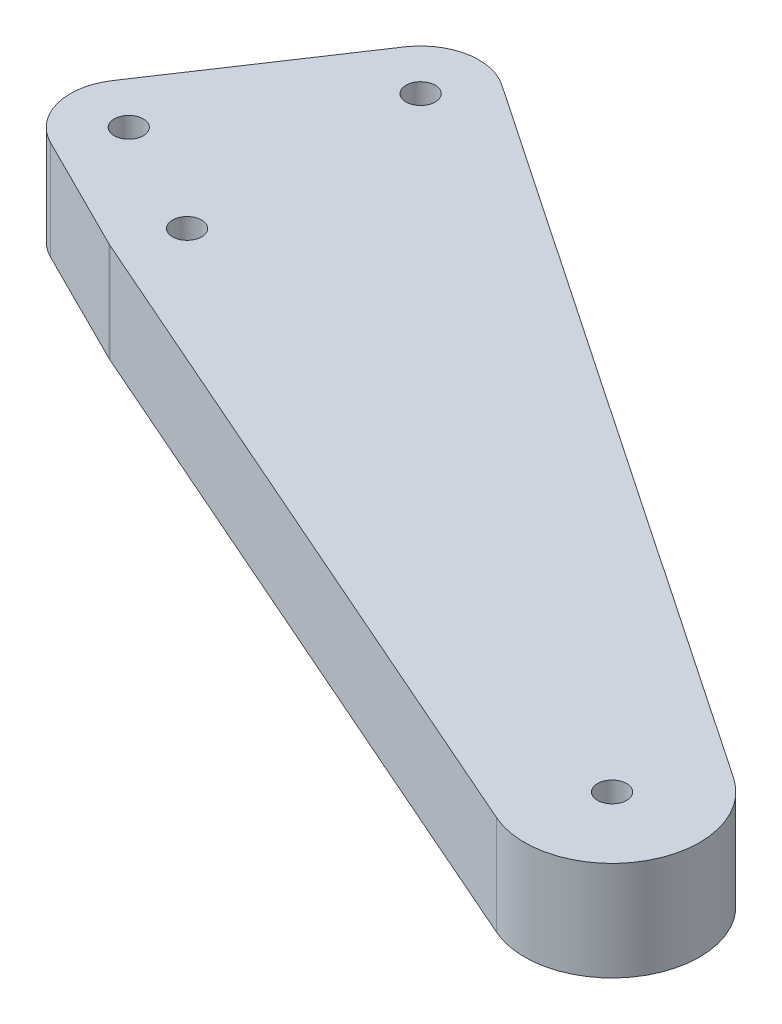
ISO-10303-21;
HEADER;
FILE_DESCRIPTION(('STEP AP214'),'2;1');
FILE_NAME('part.step','',(''),(''),'','','');
FILE_SCHEMA(('AUTOMOTIVE_DESIGN { 1 0 10303 214 1 1 1 1 }'));
ENDSEC;
DATA;
#1=APPLICATION_CONTEXT('core data for automotive mechanical design processes');
#2=APPLICATION_PROTOCOL_DEFINITION('international standard','automotive_design',2000,#1);
#3=PRODUCT_CONTEXT('',#1,'mechanical');
#4=PRODUCT('Part','Part','',(#3));
#5=PRODUCT_RELATED_PRODUCT_CATEGORY('part','',(#4));
#6=PRODUCT_DEFINITION_FORMATION('','',#4);
#7=PRODUCT_DEFINITION_CONTEXT('part definition',#1,'design');
#8=PRODUCT_DEFINITION('design','',#6,#7);
#9=PRODUCT_DEFINITION_SHAPE('','',#8);
#10=(LENGTH_UNIT() NAMED_UNIT(*) SI_UNIT(.MILLI.,.METRE.));
#11=(NAMED_UNIT(*) PLANE_ANGLE_UNIT() SI_UNIT($,.RADIAN.));
#12=(NAMED_UNIT(*) SI_UNIT($,.STERADIAN.) SOLID_ANGLE_UNIT());
#13=UNCERTAINTY_MEASURE_WITH_UNIT(LENGTH_MEASURE(1.E-05),#10,'distance_accuracy_value','');
#14=(GEOMETRIC_REPRESENTATION_CONTEXT(3) GLOBAL_UNCERTAINTY_ASSIGNED_CONTEXT((#13)) GLOBAL_UNIT_ASSIGNED_CONTEXT((#10,
#11,#12)) REPRESENTATION_CONTEXT('',''));
#15=CARTESIAN_POINT('',(0.,0.,0.));
#16=DIRECTION('',(0.,0.,1.));
#17=DIRECTION('',(1.,0.,0.));
#18=AXIS2_PLACEMENT_3D('',#15,#16,#17);
#19=CARTESIAN_POINT('',(0.,17.,0.));
#20=DIRECTION('',(0.,-1.,0.));
#21=DIRECTION('',(0.,0.,-1.));
#22=AXIS2_PLACEMENT_3D('',#19,#20,#21);
#23=CYLINDRICAL_SURFACE('',#22,9.99999999999999);
#24=CARTESIAN_POINT('',(0.,0.,0.));
#25=DIRECTION('',(0.,1.,0.));
#26=DIRECTION('',(0.,0.,-1.));
#27=AXIS2_PLACEMENT_3D('',#24,#25,#26);
#28=CIRCLE('',#27,9.99999999999999);
#29=CARTESIAN_POINT('',(-4.47213595499958,0.,8.94427190999916));
#30=VERTEX_POINT('',#29);
#31=CARTESIAN_POINT('',(-4.01845025204397,0.,9.15707691197621));
#32=VERTEX_POINT('',#31);
#33=EDGE_CURVE('E144',#30,#32,#28,.T.);
#34=ORIENTED_EDGE('',*,*,#33,.T.);
#35=DIRECTION('',(0.,-1.,0.));
#36=VECTOR('',#35,1.);
#37=CARTESIAN_POINT('',(-4.01845025204397,17.,9.15707691197621));
#38=LINE('',#37,#36);
#39=CARTESIAN_POINT('',(-4.01845025204397,17.,9.15707691197621));
#40=VERTEX_POINT('',#39);
#41=EDGE_CURVE('E11',#40,#32,#38,.T.);
#42=ORIENTED_EDGE('',*,*,#41,.F.);
#43=CARTESIAN_POINT('',(0.,17.,0.));
#44=DIRECTION('',(0.,1.,0.));
#45=DIRECTION('',(0.,0.,-1.));
#46=AXIS2_PLACEMENT_3D('',#43,#44,#45);
#47=CIRCLE('',#46,9.99999999999999);
#48=CARTESIAN_POINT('',(-4.47213595499958,17.,8.94427190999916));
#49=VERTEX_POINT('',#48);
#50=EDGE_CURVE('E167',#49,#40,#47,.T.);
#51=ORIENTED_EDGE('',*,*,#50,.F.);
#52=DIRECTION('',(0.,-1.,0.));
#53=VECTOR('',#52,1.);
#54=CARTESIAN_POINT('',(-4.47213595499958,17.,8.94427190999916));
#55=LINE('',#54,#53);
#56=EDGE_CURVE('E140',#49,#30,#55,.T.);
#57=ORIENTED_EDGE('',*,*,#56,.T.);
#58=EDGE_LOOP('',(#34,#42,#51,#57));
#59=FACE_BOUND('',#58,.T.);
#60=ADVANCED_FACE('F43',(#59),#23,.T.);
#61=CARTESIAN_POINT('',(113.972324621934,17.,60.9356153679643));
#62=DIRECTION('',(0.401845025204397,0.,-0.915707691197621));
#63=DIRECTION('',(-0.915707691197621,0.,-0.401845025204397));
#64=AXIS2_PLACEMENT_3D('',#61,#62,#63);
#65=PLANE('',#64);
#66=DIRECTION('',(0.915707691197621,0.,0.401845025204397));
#67=VECTOR('',#66,1.);
#68=CARTESIAN_POINT('',(113.972324621934,0.,60.9356153679643));
#69=LINE('',#68,#67);
#70=CARTESIAN_POINT('',(113.972324621934,0.,60.9356153679643));
#71=VERTEX_POINT('',#70);
#72=EDGE_CURVE('E148',#32,#71,#69,.T.);
#73=ORIENTED_EDGE('',*,*,#72,.T.);
#74=DIRECTION('',(0.,-1.,0.));
#75=VECTOR('',#74,1.);
#76=CARTESIAN_POINT('',(113.972324621934,17.,60.9356153679643));
#77=LINE('',#76,#75);
#78=CARTESIAN_POINT('',(113.972324621934,17.,60.9356153679643));
#79=VERTEX_POINT('',#78);
#80=EDGE_CURVE('E52',#79,#71,#77,.T.);
#81=ORIENTED_EDGE('',*,*,#80,.F.);
#82=DIRECTION('',(0.915707691197621,0.,0.401845025204397));
#83=VECTOR('',#82,1.);
#84=CARTESIAN_POINT('',(113.972324621934,17.,60.9356153679643));
#85=LINE('',#84,#83);
#86=EDGE_CURVE('E103',#40,#79,#85,.T.);
#87=ORIENTED_EDGE('',*,*,#86,.F.);
#88=ORIENTED_EDGE('',*,*,#41,.T.);
#89=EDGE_LOOP('',(#73,#81,#87,#88));
#90=FACE_BOUND('',#89,.T.);
#91=ADVANCED_FACE('F276',(#90),#65,.F.);
#92=CARTESIAN_POINT('',(120.,17.,47.2));
#93=DIRECTION('',(0.,-1.,0.));
#94=DIRECTION('',(0.,0.,-1.));
#95=AXIS2_PLACEMENT_3D('',#92,#93,#94);
#96=CYLINDRICAL_SURFACE('',#95,15.);
#97=CARTESIAN_POINT('',(120.,0.,47.2));
#98=DIRECTION('',(0.,1.,0.));
#99=DIRECTION('',(0.,0.,-1.));
#100=AXIS2_PLACEMENT_3D('',#97,#98,#99);
#101=CIRCLE('',#100,15.);
#102=CARTESIAN_POINT('',(128.403734524762,0.,34.7751359750975));
#103=VERTEX_POINT('',#102);
#104=EDGE_CURVE('E152',#71,#103,#101,.T.);
#105=ORIENTED_EDGE('',*,*,#104,.T.);
#106=DIRECTION('',(0.,-1.,0.));
#107=VECTOR('',#106,1.);
#108=CARTESIAN_POINT('',(128.403734524762,17.,34.7751359750975));
#109=LINE('',#108,#107);
#110=CARTESIAN_POINT('',(128.403734524762,17.,34.7751359750975));
#111=VERTEX_POINT('',#110);
#112=EDGE_CURVE('E178',#111,#103,#109,.T.);
#113=ORIENTED_EDGE('',*,*,#112,.F.);
#114=CARTESIAN_POINT('',(120.,17.,47.2));
#115=DIRECTION('',(0.,1.,0.));
#116=DIRECTION('',(0.,0.,-1.));
#117=AXIS2_PLACEMENT_3D('',#114,#115,#116);
#118=CIRCLE('',#117,15.);
#119=EDGE_CURVE('E188',#79,#111,#118,.T.);
#120=ORIENTED_EDGE('',*,*,#119,.F.);
#121=ORIENTED_EDGE('',*,*,#80,.T.);
#122=EDGE_LOOP('',(#105,#113,#120,#121));
#123=FACE_BOUND('',#122,.T.);
#124=ADVANCED_FACE('F186',(#123),#96,.T.);
#125=CARTESIAN_POINT('',(5.60248968317497,17.,-48.2832426832683));
#126=DIRECTION('',(-0.560248968317497,0.,0.828324268326831));
#127=DIRECTION('',(0.828324268326831,0.,0.560248968317497));
#128=AXIS2_PLACEMENT_3D('',#125,#126,#127);
#129=PLANE('',#128);
#130=DIRECTION('',(-0.828324268326831,0.,-0.560248968317497));
#131=VECTOR('',#130,1.);
#132=CARTESIAN_POINT('',(5.60248968317497,0.,-48.2832426832683));
#133=LINE('',#132,#131);
#134=CARTESIAN_POINT('',(5.60248968317498,0.,-48.2832426832683));
#135=VERTEX_POINT('',#134);
#136=EDGE_CURVE('E155',#103,#135,#133,.T.);
#137=ORIENTED_EDGE('',*,*,#136,.T.);
#138=DIRECTION('',(0.,-1.,0.));
#139=VECTOR('',#138,1.);
#140=CARTESIAN_POINT('',(5.60248968317498,17.,-48.2832426832683));
#141=LINE('',#140,#139);
#142=CARTESIAN_POINT('',(5.60248968317498,17.,-48.2832426832683));
#143=VERTEX_POINT('',#142);
#144=EDGE_CURVE('E174',#143,#135,#141,.T.);
#145=ORIENTED_EDGE('',*,*,#144,.F.);
#146=DIRECTION('',(-0.828324268326831,0.,-0.560248968317497));
#147=VECTOR('',#146,1.);
#148=CARTESIAN_POINT('',(5.60248968317497,17.,-48.2832426832683));
#149=LINE('',#148,#147);
#150=EDGE_CURVE('E201',#111,#143,#149,.T.);
#151=ORIENTED_EDGE('',*,*,#150,.F.);
#152=ORIENTED_EDGE('',*,*,#112,.T.);
#153=EDGE_LOOP('',(#137,#145,#151,#152));
#154=FACE_BOUND('',#153,.T.);
#155=ADVANCED_FACE('F196',(#154),#129,.F.);
#156=CARTESIAN_POINT('',(0.,17.,-40.));
#157=DIRECTION('',(0.,-1.,0.));
#158=DIRECTION('',(0.,0.,-1.));
#159=AXIS2_PLACEMENT_3D('',#156,#157,#158);
#160=CYLINDRICAL_SURFACE('',#159,10.);
#161=CARTESIAN_POINT('',(0.,0.,-40.));
#162=DIRECTION('',(0.,1.,0.));
#163=DIRECTION('',(0.,0.,-1.));
#164=AXIS2_PLACEMENT_3D('',#161,#162,#163);
#165=CIRCLE('',#164,10.);
#166=CARTESIAN_POINT('',(-8.32050294337844,0.,-45.5470019622523));
#167=VERTEX_POINT('',#166);
#168=EDGE_CURVE('E158',#135,#167,#165,.T.);
#169=ORIENTED_EDGE('',*,*,#168,.T.);
#170=DIRECTION('',(0.,-1.,0.));
#171=VECTOR('',#170,1.);
#172=CARTESIAN_POINT('',(-8.32050294337844,17.,-45.5470019622523));
#173=LINE('',#172,#171);
#174=CARTESIAN_POINT('',(-8.32050294337844,17.,-45.5470019622523));
#175=VERTEX_POINT('',#174);
#176=EDGE_CURVE('E133',#175,#167,#173,.T.);
#177=ORIENTED_EDGE('',*,*,#176,.F.);
#178=CARTESIAN_POINT('',(0.,17.,-40.));
#179=DIRECTION('',(0.,1.,0.));
#180=DIRECTION('',(0.,0.,-1.));
#181=AXIS2_PLACEMENT_3D('',#178,#179,#180);
#182=CIRCLE('',#181,10.);
#183=EDGE_CURVE('E122',#143,#175,#182,.T.);
#184=ORIENTED_EDGE('',*,*,#183,.F.);
#185=ORIENTED_EDGE('',*,*,#144,.T.);
#186=EDGE_LOOP('',(#169,#177,#184,#185));
#187=FACE_BOUND('',#186,.T.);
#188=ADVANCED_FACE('F199',(#187),#160,.T.);
#189=CARTESIAN_POINT('',(-8.32050294337844,17.,-45.5470019622523));
#190=DIRECTION('',(0.832050294337844,0.,0.554700196225229));
#191=DIRECTION('',(0.554700196225229,0.,-0.832050294337844));
#192=AXIS2_PLACEMENT_3D('',#189,#190,#191);
#193=PLANE('',#192);
#194=DIRECTION('',(-0.554700196225229,0.,0.832050294337844));
#195=VECTOR('',#194,1.);
#196=CARTESIAN_POINT('',(-8.32050294337844,0.,-45.5470019622523));
#197=LINE('',#196,#195);
#198=CARTESIAN_POINT('',(-28.3205029433784,0.,-15.5470019622523));
#199=VERTEX_POINT('',#198);
#200=EDGE_CURVE('E131',#167,#199,#197,.T.);
#201=ORIENTED_EDGE('',*,*,#200,.T.);
#202=DIRECTION('',(0.,-1.,0.));
#203=VECTOR('',#202,1.);
#204=CARTESIAN_POINT('',(-28.3205029433784,17.,-15.5470019622523));
#205=LINE('',#204,#203);
#206=CARTESIAN_POINT('',(-28.3205029433784,17.,-15.5470019622523));
#207=VERTEX_POINT('',#206);
#208=EDGE_CURVE('E128',#207,#199,#205,.T.);
#209=ORIENTED_EDGE('',*,*,#208,.F.);
#210=DIRECTION('',(-0.554700196225229,0.,0.832050294337844));
#211=VECTOR('',#210,1.);
#212=CARTESIAN_POINT('',(-8.32050294337844,17.,-45.5470019622523));
#213=LINE('',#212,#211);
#214=EDGE_CURVE('E116',#175,#207,#213,.T.);
#215=ORIENTED_EDGE('',*,*,#214,.F.);
#216=ORIENTED_EDGE('',*,*,#176,.T.);
#217=EDGE_LOOP('',(#201,#209,#215,#216));
#218=FACE_BOUND('',#217,.T.);
#219=ADVANCED_FACE('F129',(#218),#193,.F.);
#220=CARTESIAN_POINT('',(-20.,17.,-10.));
#221=DIRECTION('',(0.,-1.,0.));
#222=DIRECTION('',(0.,0.,-1.));
#223=AXIS2_PLACEMENT_3D('',#220,#221,#222);
#224=CYLINDRICAL_SURFACE('',#223,10.);
#225=CARTESIAN_POINT('',(-20.,0.,-10.));
#226=DIRECTION('',(0.,1.,0.));
#227=DIRECTION('',(0.,0.,1.));
#228=AXIS2_PLACEMENT_3D('',#225,#226,#227);
#229=CIRCLE('',#228,10.);
#230=CARTESIAN_POINT('',(-24.4721359549996,0.,-1.05572809000085));
#231=VERTEX_POINT('',#230);
#232=EDGE_CURVE('E89',#199,#231,#229,.T.);
#233=ORIENTED_EDGE('',*,*,#232,.T.);
#234=DIRECTION('',(0.,-1.,0.));
#235=VECTOR('',#234,1.);
#236=CARTESIAN_POINT('',(-24.4721359549996,17.,-1.05572809000085));
#237=LINE('',#236,#235);
#238=CARTESIAN_POINT('',(-24.4721359549996,17.,-1.05572809000085));
#239=VERTEX_POINT('',#238);
#240=EDGE_CURVE('E134',#239,#231,#237,.T.);
#241=ORIENTED_EDGE('',*,*,#240,.F.);
#242=CARTESIAN_POINT('',(-20.,17.,-10.));
#243=DIRECTION('',(0.,1.,0.));
#244=DIRECTION('',(0.,0.,1.));
#245=AXIS2_PLACEMENT_3D('',#242,#243,#244);
#246=CIRCLE('',#245,10.);
#247=EDGE_CURVE('E120',#207,#239,#246,.T.);
#248=ORIENTED_EDGE('',*,*,#247,.F.);
#249=ORIENTED_EDGE('',*,*,#208,.T.);
#250=EDGE_LOOP('',(#233,#241,#248,#249));
#251=FACE_BOUND('',#250,.T.);
#252=ADVANCED_FACE('F136',(#251),#224,.T.);
#253=CARTESIAN_POINT('',(-24.4721359549996,17.,-1.05572809000085));
#254=DIRECTION('',(0.447213595499958,0.,-0.894427190999916));
#255=DIRECTION('',(-0.894427190999916,0.,-0.447213595499958));
#256=AXIS2_PLACEMENT_3D('',#253,#254,#255);
#257=PLANE('',#256);
#258=DIRECTION('',(0.894427190999916,0.,0.447213595499958));
#259=VECTOR('',#258,1.);
#260=CARTESIAN_POINT('',(-24.4721359549996,0.,-1.05572809000085));
#261=LINE('',#260,#259);
#262=EDGE_CURVE('E95',#231,#30,#261,.T.);
#263=ORIENTED_EDGE('',*,*,#262,.T.);
#264=ORIENTED_EDGE('',*,*,#56,.F.);
#265=DIRECTION('',(0.894427190999916,0.,0.447213595499958));
#266=VECTOR('',#265,1.);
#267=CARTESIAN_POINT('',(-24.4721359549996,17.,-1.05572809000085));
#268=LINE('',#267,#266);
#269=EDGE_CURVE('E60',#239,#49,#268,.T.);
#270=ORIENTED_EDGE('',*,*,#269,.F.);
#271=ORIENTED_EDGE('',*,*,#240,.T.);
#272=EDGE_LOOP('',(#263,#264,#270,#271));
#273=FACE_BOUND('',#272,.T.);
#274=ADVANCED_FACE('F254',(#273),#257,.F.);
#275=CARTESIAN_POINT('',(0.,17.,0.));
#276=DIRECTION('',(0.,-1.,0.));
#277=DIRECTION('',(0.,0.,-1.));
#278=AXIS2_PLACEMENT_3D('',#275,#276,#277);
#279=PLANE('',#278);
#280=CARTESIAN_POINT('',(0.,17.,-40.));
#281=DIRECTION('',(0.,1.,0.));
#282=DIRECTION('',(0.,0.,1.));
#283=AXIS2_PLACEMENT_3D('',#280,#281,#282);
#284=CIRCLE('',#283,2.5);
#285=CARTESIAN_POINT('',(0.,17.,-37.5));
#286=VERTEX_POINT('',#285);
#287=EDGE_CURVE('E235',#286,#286,#284,.T.);
#288=ORIENTED_EDGE('',*,*,#287,.F.);
#289=EDGE_LOOP('',(#288));
#290=FACE_BOUND('',#289,.T.);
#291=CARTESIAN_POINT('',(0.,17.,0.));
#292=DIRECTION('',(0.,1.,0.));
#293=DIRECTION('',(0.,0.,1.));
#294=AXIS2_PLACEMENT_3D('',#291,#292,#293);
#295=CIRCLE('',#294,2.5);
#296=CARTESIAN_POINT('',(0.,17.,2.5));
#297=VERTEX_POINT('',#296);
#298=EDGE_CURVE('E231',#297,#297,#295,.T.);
#299=ORIENTED_EDGE('',*,*,#298,.F.);
#300=EDGE_LOOP('',(#299));
#301=FACE_BOUND('',#300,.T.);
#302=CARTESIAN_POINT('',(120.,17.,47.2));
#303=DIRECTION('',(0.,1.,0.));
#304=DIRECTION('',(0.,0.,1.));
#305=AXIS2_PLACEMENT_3D('',#302,#303,#304);
#306=CIRCLE('',#305,2.50000000000001);
#307=CARTESIAN_POINT('',(120.,17.,49.7));
#308=VERTEX_POINT('',#307);
#309=EDGE_CURVE('E223',#308,#308,#306,.T.);
#310=ORIENTED_EDGE('',*,*,#309,.F.);
#311=EDGE_LOOP('',(#310));
#312=FACE_BOUND('',#311,.T.);
#313=CARTESIAN_POINT('',(-20.,17.,-10.));
#314=DIRECTION('',(0.,1.,0.));
#315=DIRECTION('',(0.,0.,1.));
#316=AXIS2_PLACEMENT_3D('',#313,#314,#315);
#317=CIRCLE('',#316,2.5);
#318=CARTESIAN_POINT('',(-20.,17.,-7.5));
#319=VERTEX_POINT('',#318);
#320=EDGE_CURVE('E215',#319,#319,#317,.T.);
#321=ORIENTED_EDGE('',*,*,#320,.F.);
#322=EDGE_LOOP('',(#321));
#323=FACE_BOUND('',#322,.T.);
#324=ORIENTED_EDGE('',*,*,#50,.T.);
#325=ORIENTED_EDGE('',*,*,#86,.T.);
#326=ORIENTED_EDGE('',*,*,#119,.T.);
#327=ORIENTED_EDGE('',*,*,#150,.T.);
#328=ORIENTED_EDGE('',*,*,#183,.T.);
#329=ORIENTED_EDGE('',*,*,#214,.T.);
#330=ORIENTED_EDGE('',*,*,#247,.T.);
#331=ORIENTED_EDGE('',*,*,#269,.T.);
#332=EDGE_LOOP('',(#324,#325,#326,#327,#328,#329,#330,#331));
#333=FACE_BOUND('',#332,.T.);
#334=ADVANCED_FACE('F118',(#290,#301,#312,#323,#333),#279,.F.);
#335=CARTESIAN_POINT('',(0.,0.,0.));
#336=DIRECTION('',(0.,-1.,0.));
#337=DIRECTION('',(0.,0.,-1.));
#338=AXIS2_PLACEMENT_3D('',#335,#336,#337);
#339=PLANE('',#338);
#340=CARTESIAN_POINT('',(0.,0.,-40.));
#341=DIRECTION('',(0.,1.,0.));
#342=DIRECTION('',(0.,0.,1.));
#343=AXIS2_PLACEMENT_3D('',#340,#341,#342);
#344=CIRCLE('',#343,2.5);
#345=CARTESIAN_POINT('',(0.,0.,-37.5));
#346=VERTEX_POINT('',#345);
#347=EDGE_CURVE('E149',#346,#346,#344,.T.);
#348=ORIENTED_EDGE('',*,*,#347,.T.);
#349=EDGE_LOOP('',(#348));
#350=FACE_BOUND('',#349,.T.);
#351=CARTESIAN_POINT('',(0.,0.,0.));
#352=DIRECTION('',(0.,1.,0.));
#353=DIRECTION('',(0.,0.,1.));
#354=AXIS2_PLACEMENT_3D('',#351,#352,#353);
#355=CIRCLE('',#354,2.5);
#356=CARTESIAN_POINT('',(0.,0.,2.5));
#357=VERTEX_POINT('',#356);
#358=EDGE_CURVE('E227',#357,#357,#355,.T.);
#359=ORIENTED_EDGE('',*,*,#358,.T.);
#360=EDGE_LOOP('',(#359));
#361=FACE_BOUND('',#360,.T.);
#362=CARTESIAN_POINT('',(120.,0.,47.2));
#363=DIRECTION('',(0.,1.,0.));
#364=DIRECTION('',(0.,0.,1.));
#365=AXIS2_PLACEMENT_3D('',#362,#363,#364);
#366=CIRCLE('',#365,2.50000000000001);
#367=CARTESIAN_POINT('',(120.,0.,49.7));
#368=VERTEX_POINT('',#367);
#369=EDGE_CURVE('E219',#368,#368,#366,.T.);
#370=ORIENTED_EDGE('',*,*,#369,.T.);
#371=EDGE_LOOP('',(#370));
#372=FACE_BOUND('',#371,.T.);
#373=CARTESIAN_POINT('',(-20.,0.,-10.));
#374=DIRECTION('',(0.,1.,0.));
#375=DIRECTION('',(0.,0.,1.));
#376=AXIS2_PLACEMENT_3D('',#373,#374,#375);
#377=CIRCLE('',#376,2.5);
#378=CARTESIAN_POINT('',(-20.,0.,-7.5));
#379=VERTEX_POINT('',#378);
#380=EDGE_CURVE('E211',#379,#379,#377,.T.);
#381=ORIENTED_EDGE('',*,*,#380,.T.);
#382=EDGE_LOOP('',(#381));
#383=FACE_BOUND('',#382,.T.);
#384=ORIENTED_EDGE('',*,*,#33,.F.);
#385=ORIENTED_EDGE('',*,*,#262,.F.);
#386=ORIENTED_EDGE('',*,*,#232,.F.);
#387=ORIENTED_EDGE('',*,*,#200,.F.);
#388=ORIENTED_EDGE('',*,*,#168,.F.);
#389=ORIENTED_EDGE('',*,*,#136,.F.);
#390=ORIENTED_EDGE('',*,*,#104,.F.);
#391=ORIENTED_EDGE('',*,*,#72,.F.);
#392=EDGE_LOOP('',(#384,#385,#386,#387,#388,#389,#390,#391));
#393=FACE_BOUND('',#392,.T.);
#394=ADVANCED_FACE('F192',(#350,#361,#372,#383,#393),#339,.T.);
#395=CARTESIAN_POINT('',(-20.,0.,-10.));
#396=DIRECTION('',(0.,1.,0.));
#397=DIRECTION('',(0.,0.,1.));
#398=AXIS2_PLACEMENT_3D('',#395,#396,#397);
#399=CYLINDRICAL_SURFACE('',#398,2.5);
#400=ORIENTED_EDGE('',*,*,#380,.F.);
#401=EDGE_LOOP('',(#400));
#402=FACE_BOUND('',#401,.T.);
#403=ORIENTED_EDGE('',*,*,#320,.T.);
#404=EDGE_LOOP('',(#403));
#405=FACE_BOUND('',#404,.T.);
#406=ADVANCED_FACE('F262',(#402,#405),#399,.F.);
#407=CARTESIAN_POINT('',(120.,0.,47.2));
#408=DIRECTION('',(0.,1.,0.));
#409=DIRECTION('',(0.,0.,1.));
#410=AXIS2_PLACEMENT_3D('',#407,#408,#409);
#411=CYLINDRICAL_SURFACE('',#410,2.50000000000001);
#412=ORIENTED_EDGE('',*,*,#369,.F.);
#413=EDGE_LOOP('',(#412));
#414=FACE_BOUND('',#413,.T.);
#415=ORIENTED_EDGE('',*,*,#309,.T.);
#416=EDGE_LOOP('',(#415));
#417=FACE_BOUND('',#416,.T.);
#418=ADVANCED_FACE('F264',(#414,#417),#411,.F.);
#419=CARTESIAN_POINT('',(0.,0.,0.));
#420=DIRECTION('',(0.,1.,0.));
#421=DIRECTION('',(0.,0.,1.));
#422=AXIS2_PLACEMENT_3D('',#419,#420,#421);
#423=CYLINDRICAL_SURFACE('',#422,2.5);
#424=ORIENTED_EDGE('',*,*,#358,.F.);
#425=EDGE_LOOP('',(#424));
#426=FACE_BOUND('',#425,.T.);
#427=ORIENTED_EDGE('',*,*,#298,.T.);
#428=EDGE_LOOP('',(#427));
#429=FACE_BOUND('',#428,.T.);
#430=ADVANCED_FACE('F248',(#426,#429),#423,.F.);
#431=CARTESIAN_POINT('',(0.,0.,-40.));
#432=DIRECTION('',(0.,1.,0.));
#433=DIRECTION('',(0.,0.,1.));
#434=AXIS2_PLACEMENT_3D('',#431,#432,#433);
#435=CYLINDRICAL_SURFACE('',#434,2.5);
#436=ORIENTED_EDGE('',*,*,#347,.F.);
#437=EDGE_LOOP('',(#436));
#438=FACE_BOUND('',#437,.T.);
#439=ORIENTED_EDGE('',*,*,#287,.T.);
#440=EDGE_LOOP('',(#439));
#441=FACE_BOUND('',#440,.T.);
#442=ADVANCED_FACE('F245',(#438,#441),#435,.F.);
#443=CLOSED_SHELL('',(#60,#91,#124,#155,#188,#219,#252,#274,#334,#394,#406,#418,#430,#442));
#444=MANIFOLD_SOLID_BREP('B2',#443);
#445=ADVANCED_BREP_SHAPE_REPRESENTATION('',(#18,#444),#14);
#446=SHAPE_DEFINITION_REPRESENTATION(#9,#445);
ENDSEC;
END-ISO-10303-21;
